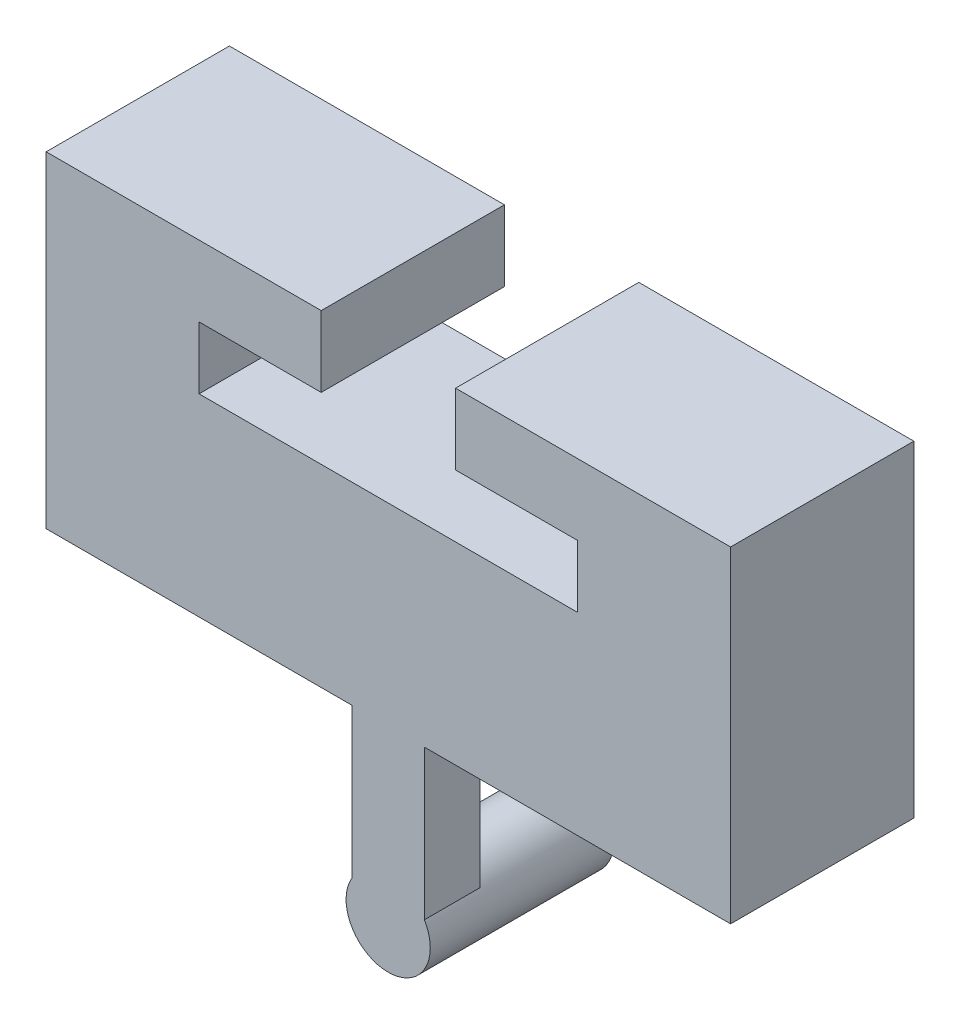
ISO-10303-21;
HEADER;
FILE_DESCRIPTION(('STEP AP214'),'2;1');
FILE_NAME('part.step','',(''),(''),'','','');
FILE_SCHEMA(('AUTOMOTIVE_DESIGN { 1 0 10303 214 1 1 1 1 }'));
ENDSEC;
DATA;
#1=APPLICATION_CONTEXT('core data for automotive mechanical design processes');
#2=APPLICATION_PROTOCOL_DEFINITION('international standard','automotive_design',2000,#1);
#3=PRODUCT_CONTEXT('',#1,'mechanical');
#4=PRODUCT('Part','Part','',(#3));
#5=PRODUCT_RELATED_PRODUCT_CATEGORY('part','',(#4));
#6=PRODUCT_DEFINITION_FORMATION('','',#4);
#7=PRODUCT_DEFINITION_CONTEXT('part definition',#1,'design');
#8=PRODUCT_DEFINITION('design','',#6,#7);
#9=PRODUCT_DEFINITION_SHAPE('','',#8);
#10=(LENGTH_UNIT() NAMED_UNIT(*) SI_UNIT(.MILLI.,.METRE.));
#11=(NAMED_UNIT(*) PLANE_ANGLE_UNIT() SI_UNIT($,.RADIAN.));
#12=(NAMED_UNIT(*) SI_UNIT($,.STERADIAN.) SOLID_ANGLE_UNIT());
#13=UNCERTAINTY_MEASURE_WITH_UNIT(LENGTH_MEASURE(1.E-05),#10,'distance_accuracy_value','');
#14=(GEOMETRIC_REPRESENTATION_CONTEXT(3) GLOBAL_UNCERTAINTY_ASSIGNED_CONTEXT((#13)) GLOBAL_UNIT_ASSIGNED_CONTEXT((#10,
#11,#12)) REPRESENTATION_CONTEXT('',''));
#15=CARTESIAN_POINT('',(0.,0.,0.));
#16=DIRECTION('',(0.,0.,1.));
#17=DIRECTION('',(1.,0.,0.));
#18=AXIS2_PLACEMENT_3D('',#15,#16,#17);
#19=CARTESIAN_POINT('',(0.,0.,38.1));
#20=DIRECTION('',(0.,1.,0.));
#21=DIRECTION('',(0.,0.,1.));
#22=AXIS2_PLACEMENT_3D('',#19,#20,#21);
#23=PLANE('',#22);
#24=DIRECTION('',(0.,0.,1.));
#25=VECTOR('',#24,1.);
#26=CARTESIAN_POINT('',(78.6479942270176,0.,26.5277188026789));
#27=LINE('',#26,#25);
#28=CARTESIAN_POINT('',(78.6479942270176,0.,26.5277188026789));
#29=VERTEX_POINT('',#28);
#30=CARTESIAN_POINT('',(78.6479942270176,0.,38.1));
#31=VERTEX_POINT('',#30);
#32=EDGE_CURVE('E268',#29,#31,#27,.T.);
#33=ORIENTED_EDGE('',*,*,#32,.F.);
#34=DIRECTION('',(-1.,0.,0.));
#35=VECTOR('',#34,1.);
#36=CARTESIAN_POINT('',(78.6479942270176,0.,26.5277188026789));
#37=LINE('',#36,#35);
#38=CARTESIAN_POINT('',(63.592005809709,0.,26.5277188026789));
#39=VERTEX_POINT('',#38);
#40=EDGE_CURVE('E283',#29,#39,#37,.T.);
#41=ORIENTED_EDGE('',*,*,#40,.T.);
#42=DIRECTION('',(0.,0.,1.));
#43=VECTOR('',#42,1.);
#44=CARTESIAN_POINT('',(63.592005809709,0.,26.5277188026789));
#45=LINE('',#44,#43);
#46=CARTESIAN_POINT('',(63.592005809709,0.,38.1));
#47=VERTEX_POINT('',#46);
#48=EDGE_CURVE('E177',#39,#47,#45,.T.);
#49=ORIENTED_EDGE('',*,*,#48,.T.);
#50=DIRECTION('',(1.,0.,0.));
#51=VECTOR('',#50,1.);
#52=CARTESIAN_POINT('',(0.,0.,38.1));
#53=LINE('',#52,#51);
#54=CARTESIAN_POINT('',(0.,0.,38.1));
#55=VERTEX_POINT('',#54);
#56=EDGE_CURVE('E116',#55,#47,#53,.T.);
#57=ORIENTED_EDGE('',*,*,#56,.F.);
#58=DIRECTION('',(0.,0.,-1.));
#59=VECTOR('',#58,1.);
#60=CARTESIAN_POINT('',(0.,0.,38.1));
#61=LINE('',#60,#59);
#62=CARTESIAN_POINT('',(0.,0.,0.));
#63=VERTEX_POINT('',#62);
#64=EDGE_CURVE('E47',#55,#63,#61,.T.);
#65=ORIENTED_EDGE('',*,*,#64,.T.);
#66=DIRECTION('',(1.,0.,0.));
#67=VECTOR('',#66,1.);
#68=CARTESIAN_POINT('',(0.,0.,0.));
#69=LINE('',#68,#67);
#70=CARTESIAN_POINT('',(142.319474342929,0.,0.));
#71=VERTEX_POINT('',#70);
#72=EDGE_CURVE('E176',#63,#71,#69,.T.);
#73=ORIENTED_EDGE('',*,*,#72,.T.);
#74=DIRECTION('',(0.,0.,-1.));
#75=VECTOR('',#74,1.);
#76=CARTESIAN_POINT('',(142.319474342929,0.,38.1));
#77=LINE('',#76,#75);
#78=CARTESIAN_POINT('',(142.319474342929,0.,38.1));
#79=VERTEX_POINT('',#78);
#80=EDGE_CURVE('E219',#79,#71,#77,.T.);
#81=ORIENTED_EDGE('',*,*,#80,.F.);
#82=EDGE_CURVE('E265',#31,#79,#53,.T.);
#83=ORIENTED_EDGE('',*,*,#82,.F.);
#84=EDGE_LOOP('',(#33,#41,#49,#57,#65,#73,#81,#83));
#85=FACE_BOUND('',#84,.T.);
#86=ADVANCED_FACE('F39',(#85),#23,.F.);
#87=CARTESIAN_POINT('',(0.,67.883016850886,38.1));
#88=DIRECTION('',(1.,0.,0.));
#89=DIRECTION('',(0.,0.,-1.));
#90=AXIS2_PLACEMENT_3D('',#87,#88,#89);
#91=PLANE('',#90);
#92=DIRECTION('',(0.,-1.,0.));
#93=VECTOR('',#92,1.);
#94=CARTESIAN_POINT('',(0.,67.883016850886,0.));
#95=LINE('',#94,#93);
#96=CARTESIAN_POINT('',(0.,67.883016850886,0.));
#97=VERTEX_POINT('',#96);
#98=EDGE_CURVE('E173',#97,#63,#95,.T.);
#99=ORIENTED_EDGE('',*,*,#98,.T.);
#100=ORIENTED_EDGE('',*,*,#64,.F.);
#101=DIRECTION('',(0.,-1.,0.));
#102=VECTOR('',#101,1.);
#103=CARTESIAN_POINT('',(0.,67.883016850886,38.1));
#104=LINE('',#103,#102);
#105=CARTESIAN_POINT('',(0.,67.883016850886,38.1));
#106=VERTEX_POINT('',#105);
#107=EDGE_CURVE('E197',#106,#55,#104,.T.);
#108=ORIENTED_EDGE('',*,*,#107,.F.);
#109=DIRECTION('',(0.,0.,-1.));
#110=VECTOR('',#109,1.);
#111=CARTESIAN_POINT('',(0.,67.883016850886,38.1));
#112=LINE('',#111,#110);
#113=EDGE_CURVE('E169',#106,#97,#112,.T.);
#114=ORIENTED_EDGE('',*,*,#113,.T.);
#115=EDGE_LOOP('',(#99,#100,#108,#114));
#116=FACE_BOUND('',#115,.T.);
#117=ADVANCED_FACE('F41',(#116),#91,.F.);
#118=CARTESIAN_POINT('',(142.319474342929,0.,38.1));
#119=DIRECTION('',(-1.,0.,0.));
#120=DIRECTION('',(0.,0.,1.));
#121=AXIS2_PLACEMENT_3D('',#118,#119,#120);
#122=PLANE('',#121);
#123=DIRECTION('',(0.,1.,0.));
#124=VECTOR('',#123,1.);
#125=CARTESIAN_POINT('',(142.319474342929,0.,0.));
#126=LINE('',#125,#124);
#127=CARTESIAN_POINT('',(142.319474342929,67.883016850886,0.));
#128=VERTEX_POINT('',#127);
#129=EDGE_CURVE('E179',#71,#128,#126,.T.);
#130=ORIENTED_EDGE('',*,*,#129,.T.);
#131=DIRECTION('',(0.,0.,-1.));
#132=VECTOR('',#131,1.);
#133=CARTESIAN_POINT('',(142.319474342929,67.883016850886,38.1));
#134=LINE('',#133,#132);
#135=CARTESIAN_POINT('',(142.319474342929,67.883016850886,38.1));
#136=VERTEX_POINT('',#135);
#137=EDGE_CURVE('E216',#136,#128,#134,.T.);
#138=ORIENTED_EDGE('',*,*,#137,.F.);
#139=DIRECTION('',(0.,1.,0.));
#140=VECTOR('',#139,1.);
#141=CARTESIAN_POINT('',(142.319474342929,0.,38.1));
#142=LINE('',#141,#140);
#143=EDGE_CURVE('E243',#79,#136,#142,.T.);
#144=ORIENTED_EDGE('',*,*,#143,.F.);
#145=ORIENTED_EDGE('',*,*,#80,.T.);
#146=EDGE_LOOP('',(#130,#138,#144,#145));
#147=FACE_BOUND('',#146,.T.);
#148=ADVANCED_FACE('F234',(#147),#122,.F.);
#149=CARTESIAN_POINT('',(142.319474342929,67.883016850886,38.1));
#150=DIRECTION('',(0.,-1.,0.));
#151=DIRECTION('',(0.,0.,-1.));
#152=AXIS2_PLACEMENT_3D('',#149,#150,#151);
#153=PLANE('',#152);
#154=DIRECTION('',(-1.,0.,0.));
#155=VECTOR('',#154,1.);
#156=CARTESIAN_POINT('',(142.319474342929,67.883016850886,0.));
#157=LINE('',#156,#155);
#158=CARTESIAN_POINT('',(85.1297371714643,67.883016850886,0.));
#159=VERTEX_POINT('',#158);
#160=EDGE_CURVE('E181',#128,#159,#157,.T.);
#161=ORIENTED_EDGE('',*,*,#160,.T.);
#162=DIRECTION('',(0.,0.,-1.));
#163=VECTOR('',#162,1.);
#164=CARTESIAN_POINT('',(85.1297371714643,67.883016850886,38.1));
#165=LINE('',#164,#163);
#166=CARTESIAN_POINT('',(85.1297371714643,67.883016850886,38.1));
#167=VERTEX_POINT('',#166);
#168=EDGE_CURVE('E213',#167,#159,#165,.T.);
#169=ORIENTED_EDGE('',*,*,#168,.F.);
#170=DIRECTION('',(-1.,0.,0.));
#171=VECTOR('',#170,1.);
#172=CARTESIAN_POINT('',(142.319474342929,67.883016850886,38.1));
#173=LINE('',#172,#171);
#174=EDGE_CURVE('E240',#136,#167,#173,.T.);
#175=ORIENTED_EDGE('',*,*,#174,.F.);
#176=ORIENTED_EDGE('',*,*,#137,.T.);
#177=EDGE_LOOP('',(#161,#169,#175,#176));
#178=FACE_BOUND('',#177,.T.);
#179=ADVANCED_FACE('F238',(#178),#153,.F.);
#180=CARTESIAN_POINT('',(85.1297371714643,67.883016850886,38.1));
#181=DIRECTION('',(1.,0.,0.));
#182=DIRECTION('',(0.,0.,-1.));
#183=AXIS2_PLACEMENT_3D('',#180,#181,#182);
#184=PLANE('',#183);
#185=DIRECTION('',(0.,-1.,0.));
#186=VECTOR('',#185,1.);
#187=CARTESIAN_POINT('',(85.1297371714643,67.883016850886,0.));
#188=LINE('',#187,#186);
#189=CARTESIAN_POINT('',(85.1297371714643,53.1441387077525,0.));
#190=VERTEX_POINT('',#189);
#191=EDGE_CURVE('E183',#159,#190,#188,.T.);
#192=ORIENTED_EDGE('',*,*,#191,.T.);
#193=DIRECTION('',(0.,0.,-1.));
#194=VECTOR('',#193,1.);
#195=CARTESIAN_POINT('',(85.1297371714643,53.1441387077525,38.1));
#196=LINE('',#195,#194);
#197=CARTESIAN_POINT('',(85.1297371714643,53.1441387077525,38.1));
#198=VERTEX_POINT('',#197);
#199=EDGE_CURVE('E210',#198,#190,#196,.T.);
#200=ORIENTED_EDGE('',*,*,#199,.F.);
#201=DIRECTION('',(0.,-1.,0.));
#202=VECTOR('',#201,1.);
#203=CARTESIAN_POINT('',(85.1297371714643,67.883016850886,38.1));
#204=LINE('',#203,#202);
#205=EDGE_CURVE('E242',#167,#198,#204,.T.);
#206=ORIENTED_EDGE('',*,*,#205,.F.);
#207=ORIENTED_EDGE('',*,*,#168,.T.);
#208=EDGE_LOOP('',(#192,#200,#206,#207));
#209=FACE_BOUND('',#208,.T.);
#210=ADVANCED_FACE('F333',(#209),#184,.F.);
#211=CARTESIAN_POINT('',(85.1297371714643,53.1441387077525,38.1));
#212=DIRECTION('',(0.,1.,0.));
#213=DIRECTION('',(0.,0.,1.));
#214=AXIS2_PLACEMENT_3D('',#211,#212,#213);
#215=PLANE('',#214);
#216=DIRECTION('',(1.,0.,0.));
#217=VECTOR('',#216,1.);
#218=CARTESIAN_POINT('',(85.1297371714643,53.1441387077525,0.));
#219=LINE('',#218,#217);
#220=CARTESIAN_POINT('',(110.529737171464,53.1441387077525,0.));
#221=VERTEX_POINT('',#220);
#222=EDGE_CURVE('E185',#190,#221,#219,.T.);
#223=ORIENTED_EDGE('',*,*,#222,.T.);
#224=DIRECTION('',(0.,0.,-1.));
#225=VECTOR('',#224,1.);
#226=CARTESIAN_POINT('',(110.529737171464,53.1441387077525,38.1));
#227=LINE('',#226,#225);
#228=CARTESIAN_POINT('',(110.529737171464,53.1441387077525,38.1));
#229=VERTEX_POINT('',#228);
#230=EDGE_CURVE('E207',#229,#221,#227,.T.);
#231=ORIENTED_EDGE('',*,*,#230,.F.);
#232=DIRECTION('',(1.,0.,0.));
#233=VECTOR('',#232,1.);
#234=CARTESIAN_POINT('',(85.1297371714643,53.1441387077525,38.1));
#235=LINE('',#234,#233);
#236=EDGE_CURVE('E245',#198,#229,#235,.T.);
#237=ORIENTED_EDGE('',*,*,#236,.F.);
#238=ORIENTED_EDGE('',*,*,#199,.T.);
#239=EDGE_LOOP('',(#223,#231,#237,#238));
#240=FACE_BOUND('',#239,.T.);
#241=ADVANCED_FACE('F336',(#240),#215,.F.);
#242=CARTESIAN_POINT('',(110.529737171464,53.1441387077525,38.1));
#243=DIRECTION('',(1.,0.,0.));
#244=DIRECTION('',(0.,0.,-1.));
#245=AXIS2_PLACEMENT_3D('',#242,#243,#244);
#246=PLANE('',#245);
#247=DIRECTION('',(0.,-1.,0.));
#248=VECTOR('',#247,1.);
#249=CARTESIAN_POINT('',(110.529737171464,53.1441387077525,0.));
#250=LINE('',#249,#248);
#251=CARTESIAN_POINT('',(110.529737171464,40.1901387077525,0.));
#252=VERTEX_POINT('',#251);
#253=EDGE_CURVE('E187',#221,#252,#250,.T.);
#254=ORIENTED_EDGE('',*,*,#253,.T.);
#255=DIRECTION('',(0.,0.,-1.));
#256=VECTOR('',#255,1.);
#257=CARTESIAN_POINT('',(110.529737171464,40.1901387077525,38.1));
#258=LINE('',#257,#256);
#259=CARTESIAN_POINT('',(110.529737171464,40.1901387077525,38.1));
#260=VERTEX_POINT('',#259);
#261=EDGE_CURVE('E204',#260,#252,#258,.T.);
#262=ORIENTED_EDGE('',*,*,#261,.F.);
#263=DIRECTION('',(0.,-1.,0.));
#264=VECTOR('',#263,1.);
#265=CARTESIAN_POINT('',(110.529737171464,53.1441387077525,38.1));
#266=LINE('',#265,#264);
#267=EDGE_CURVE('E251',#229,#260,#266,.T.);
#268=ORIENTED_EDGE('',*,*,#267,.F.);
#269=ORIENTED_EDGE('',*,*,#230,.T.);
#270=EDGE_LOOP('',(#254,#262,#268,#269));
#271=FACE_BOUND('',#270,.T.);
#272=ADVANCED_FACE('F340',(#271),#246,.F.);
#273=CARTESIAN_POINT('',(110.529737171464,40.1901387077525,38.1));
#274=DIRECTION('',(0.,-1.,0.));
#275=DIRECTION('',(1.,0.,0.));
#276=AXIS2_PLACEMENT_3D('',#273,#274,#275);
#277=PLANE('',#276);
#278=DIRECTION('',(-1.,0.,0.));
#279=VECTOR('',#278,1.);
#280=CARTESIAN_POINT('',(110.529737171464,40.1901387077525,0.));
#281=LINE('',#280,#279);
#282=CARTESIAN_POINT('',(31.7897371714643,40.1901387077525,0.));
#283=VERTEX_POINT('',#282);
#284=EDGE_CURVE('E189',#252,#283,#281,.T.);
#285=ORIENTED_EDGE('',*,*,#284,.T.);
#286=DIRECTION('',(0.,0.,-1.));
#287=VECTOR('',#286,1.);
#288=CARTESIAN_POINT('',(31.7897371714643,40.1901387077525,38.1));
#289=LINE('',#288,#287);
#290=CARTESIAN_POINT('',(31.7897371714643,40.1901387077525,38.1));
#291=VERTEX_POINT('',#290);
#292=EDGE_CURVE('E201',#291,#283,#289,.T.);
#293=ORIENTED_EDGE('',*,*,#292,.F.);
#294=DIRECTION('',(-1.,0.,0.));
#295=VECTOR('',#294,1.);
#296=CARTESIAN_POINT('',(110.529737171464,40.1901387077525,38.1));
#297=LINE('',#296,#295);
#298=EDGE_CURVE('E253',#260,#291,#297,.T.);
#299=ORIENTED_EDGE('',*,*,#298,.F.);
#300=ORIENTED_EDGE('',*,*,#261,.T.);
#301=EDGE_LOOP('',(#285,#293,#299,#300));
#302=FACE_BOUND('',#301,.T.);
#303=ADVANCED_FACE('F259',(#302),#277,.F.);
#304=CARTESIAN_POINT('',(31.7897371714643,40.1901387077525,38.1));
#305=DIRECTION('',(-1.,0.,0.));
#306=DIRECTION('',(0.,0.,1.));
#307=AXIS2_PLACEMENT_3D('',#304,#305,#306);
#308=PLANE('',#307);
#309=DIRECTION('',(0.,1.,0.));
#310=VECTOR('',#309,1.);
#311=CARTESIAN_POINT('',(31.7897371714643,40.1901387077525,0.));
#312=LINE('',#311,#310);
#313=CARTESIAN_POINT('',(31.7897371714643,53.1441387077525,0.));
#314=VERTEX_POINT('',#313);
#315=EDGE_CURVE('E191',#283,#314,#312,.T.);
#316=ORIENTED_EDGE('',*,*,#315,.T.);
#317=DIRECTION('',(0.,0.,-1.));
#318=VECTOR('',#317,1.);
#319=CARTESIAN_POINT('',(31.7897371714643,53.1441387077525,38.1));
#320=LINE('',#319,#318);
#321=CARTESIAN_POINT('',(31.7897371714643,53.1441387077525,38.1));
#322=VERTEX_POINT('',#321);
#323=EDGE_CURVE('E164',#322,#314,#320,.T.);
#324=ORIENTED_EDGE('',*,*,#323,.F.);
#325=DIRECTION('',(0.,1.,0.));
#326=VECTOR('',#325,1.);
#327=CARTESIAN_POINT('',(31.7897371714643,40.1901387077525,38.1));
#328=LINE('',#327,#326);
#329=EDGE_CURVE('E152',#291,#322,#328,.T.);
#330=ORIENTED_EDGE('',*,*,#329,.F.);
#331=ORIENTED_EDGE('',*,*,#292,.T.);
#332=EDGE_LOOP('',(#316,#324,#330,#331));
#333=FACE_BOUND('',#332,.T.);
#334=ADVANCED_FACE('F263',(#333),#308,.F.);
#335=CARTESIAN_POINT('',(31.7897371714643,53.1441387077525,38.1));
#336=DIRECTION('',(0.,1.,0.));
#337=DIRECTION('',(0.,0.,1.));
#338=AXIS2_PLACEMENT_3D('',#335,#336,#337);
#339=PLANE('',#338);
#340=DIRECTION('',(1.,0.,0.));
#341=VECTOR('',#340,1.);
#342=CARTESIAN_POINT('',(31.7897371714643,53.1441387077525,0.));
#343=LINE('',#342,#341);
#344=CARTESIAN_POINT('',(57.1897371714643,53.1441387077525,0.));
#345=VERTEX_POINT('',#344);
#346=EDGE_CURVE('E161',#314,#345,#343,.T.);
#347=ORIENTED_EDGE('',*,*,#346,.T.);
#348=DIRECTION('',(0.,0.,-1.));
#349=VECTOR('',#348,1.);
#350=CARTESIAN_POINT('',(57.1897371714643,53.1441387077525,38.1));
#351=LINE('',#350,#349);
#352=CARTESIAN_POINT('',(57.1897371714643,53.1441387077525,38.1));
#353=VERTEX_POINT('',#352);
#354=EDGE_CURVE('E158',#353,#345,#351,.T.);
#355=ORIENTED_EDGE('',*,*,#354,.F.);
#356=DIRECTION('',(1.,0.,0.));
#357=VECTOR('',#356,1.);
#358=CARTESIAN_POINT('',(31.7897371714643,53.1441387077525,38.1));
#359=LINE('',#358,#357);
#360=EDGE_CURVE('E145',#322,#353,#359,.T.);
#361=ORIENTED_EDGE('',*,*,#360,.F.);
#362=ORIENTED_EDGE('',*,*,#323,.T.);
#363=EDGE_LOOP('',(#347,#355,#361,#362));
#364=FACE_BOUND('',#363,.T.);
#365=ADVANCED_FACE('F159',(#364),#339,.F.);
#366=CARTESIAN_POINT('',(57.1897371714643,53.1441387077525,38.1));
#367=DIRECTION('',(-1.,0.,0.));
#368=DIRECTION('',(0.,-1.,0.));
#369=AXIS2_PLACEMENT_3D('',#366,#367,#368);
#370=PLANE('',#369);
#371=DIRECTION('',(0.,1.,0.));
#372=VECTOR('',#371,1.);
#373=CARTESIAN_POINT('',(57.1897371714643,53.1441387077525,0.));
#374=LINE('',#373,#372);
#375=CARTESIAN_POINT('',(57.1897371714643,67.883016850886,0.));
#376=VERTEX_POINT('',#375);
#377=EDGE_CURVE('E194',#345,#376,#374,.T.);
#378=ORIENTED_EDGE('',*,*,#377,.T.);
#379=DIRECTION('',(0.,0.,-1.));
#380=VECTOR('',#379,1.);
#381=CARTESIAN_POINT('',(57.1897371714643,67.883016850886,38.1));
#382=LINE('',#381,#380);
#383=CARTESIAN_POINT('',(57.1897371714643,67.883016850886,38.1));
#384=VERTEX_POINT('',#383);
#385=EDGE_CURVE('E165',#384,#376,#382,.T.);
#386=ORIENTED_EDGE('',*,*,#385,.F.);
#387=DIRECTION('',(0.,1.,0.));
#388=VECTOR('',#387,1.);
#389=CARTESIAN_POINT('',(57.1897371714643,53.1441387077525,38.1));
#390=LINE('',#389,#388);
#391=EDGE_CURVE('E149',#353,#384,#390,.T.);
#392=ORIENTED_EDGE('',*,*,#391,.F.);
#393=ORIENTED_EDGE('',*,*,#354,.T.);
#394=EDGE_LOOP('',(#378,#386,#392,#393));
#395=FACE_BOUND('',#394,.T.);
#396=ADVANCED_FACE('F167',(#395),#370,.F.);
#397=CARTESIAN_POINT('',(57.1897371714643,67.883016850886,38.1));
#398=DIRECTION('',(0.,-1.,0.));
#399=DIRECTION('',(1.,0.,0.));
#400=AXIS2_PLACEMENT_3D('',#397,#398,#399);
#401=PLANE('',#400);
#402=DIRECTION('',(-1.,0.,0.));
#403=VECTOR('',#402,1.);
#404=CARTESIAN_POINT('',(57.1897371714643,67.883016850886,0.));
#405=LINE('',#404,#403);
#406=EDGE_CURVE('E108',#376,#97,#405,.T.);
#407=ORIENTED_EDGE('',*,*,#406,.T.);
#408=ORIENTED_EDGE('',*,*,#113,.F.);
#409=DIRECTION('',(-1.,0.,0.));
#410=VECTOR('',#409,1.);
#411=CARTESIAN_POINT('',(57.1897371714643,67.883016850886,38.1));
#412=LINE('',#411,#410);
#413=EDGE_CURVE('E63',#384,#106,#412,.T.);
#414=ORIENTED_EDGE('',*,*,#413,.F.);
#415=ORIENTED_EDGE('',*,*,#385,.T.);
#416=EDGE_LOOP('',(#407,#408,#414,#415));
#417=FACE_BOUND('',#416,.T.);
#418=ADVANCED_FACE('F264',(#417),#401,.F.);
#419=CARTESIAN_POINT('',(0.,0.,38.1));
#420=DIRECTION('',(0.,0.,1.));
#421=DIRECTION('',(1.,0.,0.));
#422=AXIS2_PLACEMENT_3D('',#419,#420,#421);
#423=PLANE('',#422);
#424=DIRECTION('',(0.,-1.,0.));
#425=VECTOR('',#424,1.);
#426=CARTESIAN_POINT('',(63.592005809709,-40.0205890994918,38.1));
#427=LINE('',#426,#425);
#428=CARTESIAN_POINT('',(63.592005809709,-31.0993664955218,38.1));
#429=VERTEX_POINT('',#428);
#430=EDGE_CURVE('E54',#47,#429,#427,.T.);
#431=ORIENTED_EDGE('',*,*,#430,.T.);
#432=CARTESIAN_POINT('',(71.1200000248106,-35.5599777975068,38.1));
#433=DIRECTION('',(0.,0.,1.));
#434=DIRECTION('',(1.,0.,0.));
#435=AXIS2_PLACEMENT_3D('',#432,#433,#434);
#436=CIRCLE('',#435,8.75030000000001);
#437=CARTESIAN_POINT('',(78.6479942270176,-31.09936647376,38.1));
#438=VERTEX_POINT('',#437);
#439=EDGE_CURVE('E275',#429,#438,#436,.T.);
#440=ORIENTED_EDGE('',*,*,#439,.T.);
#441=DIRECTION('',(0.,1.,0.));
#442=VECTOR('',#441,1.);
#443=CARTESIAN_POINT('',(78.6479942270176,-40.0205891212536,38.1));
#444=LINE('',#443,#442);
#445=EDGE_CURVE('E280',#438,#31,#444,.T.);
#446=ORIENTED_EDGE('',*,*,#445,.T.);
#447=ORIENTED_EDGE('',*,*,#82,.T.);
#448=ORIENTED_EDGE('',*,*,#143,.T.);
#449=ORIENTED_EDGE('',*,*,#174,.T.);
#450=ORIENTED_EDGE('',*,*,#205,.T.);
#451=ORIENTED_EDGE('',*,*,#236,.T.);
#452=ORIENTED_EDGE('',*,*,#267,.T.);
#453=ORIENTED_EDGE('',*,*,#298,.T.);
#454=ORIENTED_EDGE('',*,*,#329,.T.);
#455=ORIENTED_EDGE('',*,*,#360,.T.);
#456=ORIENTED_EDGE('',*,*,#391,.T.);
#457=ORIENTED_EDGE('',*,*,#413,.T.);
#458=ORIENTED_EDGE('',*,*,#107,.T.);
#459=ORIENTED_EDGE('',*,*,#56,.T.);
#460=EDGE_LOOP('',(#431,#440,#446,#447,#448,#449,#450,#451,#452,#453,#454,#455,#456,#457,#458,#459));
#461=FACE_BOUND('',#460,.T.);
#462=ADVANCED_FACE('F147',(#461),#423,.T.);
#463=CARTESIAN_POINT('',(0.,0.,0.));
#464=DIRECTION('',(0.,0.,1.));
#465=DIRECTION('',(1.,0.,0.));
#466=AXIS2_PLACEMENT_3D('',#463,#464,#465);
#467=PLANE('',#466);
#468=ORIENTED_EDGE('',*,*,#98,.F.);
#469=ORIENTED_EDGE('',*,*,#406,.F.);
#470=ORIENTED_EDGE('',*,*,#377,.F.);
#471=ORIENTED_EDGE('',*,*,#346,.F.);
#472=ORIENTED_EDGE('',*,*,#315,.F.);
#473=ORIENTED_EDGE('',*,*,#284,.F.);
#474=ORIENTED_EDGE('',*,*,#253,.F.);
#475=ORIENTED_EDGE('',*,*,#222,.F.);
#476=ORIENTED_EDGE('',*,*,#191,.F.);
#477=ORIENTED_EDGE('',*,*,#160,.F.);
#478=ORIENTED_EDGE('',*,*,#129,.F.);
#479=ORIENTED_EDGE('',*,*,#72,.F.);
#480=EDGE_LOOP('',(#468,#469,#470,#471,#472,#473,#474,#475,#476,#477,#478,#479));
#481=FACE_BOUND('',#480,.T.);
#482=ADVANCED_FACE('F228',(#481),#467,.F.);
#483=CARTESIAN_POINT('',(71.1200000248106,-35.5599777975068,26.5277188026789));
#484=DIRECTION('',(0.,0.,1.));
#485=DIRECTION('',(1.,0.,0.));
#486=AXIS2_PLACEMENT_3D('',#483,#484,#485);
#487=CYLINDRICAL_SURFACE('',#486,8.75030000000001);
#488=ORIENTED_EDGE('',*,*,#439,.F.);
#489=DIRECTION('',(0.,0.,1.));
#490=VECTOR('',#489,1.);
#491=CARTESIAN_POINT('',(63.592005809709,-31.0993664955218,0.));
#492=LINE('',#491,#490);
#493=CARTESIAN_POINT('',(63.592005809709,-31.0993664955218,26.5277188026789));
#494=VERTEX_POINT('',#493);
#495=EDGE_CURVE('E298',#429,#494,#492,.F.);
#496=ORIENTED_EDGE('',*,*,#495,.T.);
#497=CARTESIAN_POINT('',(71.1200000248106,-35.5599777975068,26.5277188026789));
#498=DIRECTION('',(0.,0.,1.));
#499=DIRECTION('',(1.,0.,0.));
#500=AXIS2_PLACEMENT_3D('',#497,#498,#499);
#501=CIRCLE('',#500,8.7503);
#502=CARTESIAN_POINT('',(78.6479942270176,-31.09936647376,26.5277188026789));
#503=VERTEX_POINT('',#502);
#504=EDGE_CURVE('E11',#503,#494,#501,.T.);
#505=ORIENTED_EDGE('',*,*,#504,.F.);
#506=DIRECTION('',(0.,0.,1.));
#507=VECTOR('',#506,1.);
#508=CARTESIAN_POINT('',(78.6479942270176,-31.09936647376,0.));
#509=LINE('',#508,#507);
#510=EDGE_CURVE('E300',#503,#438,#509,.T.);
#511=ORIENTED_EDGE('',*,*,#510,.T.);
#512=EDGE_LOOP('',(#488,#496,#505,#511));
#513=FACE_BOUND('',#512,.T.);
#514=CARTESIAN_POINT('',(71.1200000248106,-35.5599777975068,0.));
#515=DIRECTION('',(0.,0.,1.));
#516=DIRECTION('',(1.,0.,0.));
#517=AXIS2_PLACEMENT_3D('',#514,#515,#516);
#518=CIRCLE('',#517,8.7503);
#519=CARTESIAN_POINT('',(79.8703000248106,-35.5599777975068,0.));
#520=VERTEX_POINT('',#519);
#521=EDGE_CURVE('E304',#520,#520,#518,.T.);
#522=ORIENTED_EDGE('',*,*,#521,.T.);
#523=EDGE_LOOP('',(#522));
#524=FACE_BOUND('',#523,.T.);
#525=ADVANCED_FACE('F310',(#513,#524),#487,.T.);
#526=CARTESIAN_POINT('',(63.592005809709,-40.0205890994918,26.5277188026789));
#527=DIRECTION('',(-1.,0.,0.));
#528=DIRECTION('',(0.,0.,1.));
#529=AXIS2_PLACEMENT_3D('',#526,#527,#528);
#530=PLANE('',#529);
#531=ORIENTED_EDGE('',*,*,#495,.F.);
#532=ORIENTED_EDGE('',*,*,#430,.F.);
#533=ORIENTED_EDGE('',*,*,#48,.F.);
#534=DIRECTION('',(0.,-1.,0.));
#535=VECTOR('',#534,1.);
#536=CARTESIAN_POINT('',(63.592005809709,-40.0205890994918,26.5277188026789));
#537=LINE('',#536,#535);
#538=EDGE_CURVE('E289',#39,#494,#537,.T.);
#539=ORIENTED_EDGE('',*,*,#538,.T.);
#540=EDGE_LOOP('',(#531,#532,#533,#539));
#541=FACE_BOUND('',#540,.T.);
#542=ADVANCED_FACE('F359',(#541),#530,.T.);
#543=CARTESIAN_POINT('',(78.6479942270176,-40.0205891212536,26.5277188026789));
#544=DIRECTION('',(1.,0.,0.));
#545=DIRECTION('',(0.,0.,-1.));
#546=AXIS2_PLACEMENT_3D('',#543,#544,#545);
#547=PLANE('',#546);
#548=ORIENTED_EDGE('',*,*,#510,.F.);
#549=DIRECTION('',(0.,1.,0.));
#550=VECTOR('',#549,1.);
#551=CARTESIAN_POINT('',(78.6479942270176,-40.0205891212536,26.5277188026789));
#552=LINE('',#551,#550);
#553=EDGE_CURVE('E279',#503,#29,#552,.T.);
#554=ORIENTED_EDGE('',*,*,#553,.T.);
#555=ORIENTED_EDGE('',*,*,#32,.T.);
#556=ORIENTED_EDGE('',*,*,#445,.F.);
#557=EDGE_LOOP('',(#548,#554,#555,#556));
#558=FACE_BOUND('',#557,.T.);
#559=ADVANCED_FACE('F319',(#558),#547,.T.);
#560=CARTESIAN_POINT('',(71.1200000248106,-35.5599777975068,26.5277188026789));
#561=DIRECTION('',(0.,0.,1.));
#562=DIRECTION('',(1.,0.,0.));
#563=AXIS2_PLACEMENT_3D('',#560,#561,#562);
#564=PLANE('',#563);
#565=ORIENTED_EDGE('',*,*,#553,.F.);
#566=ORIENTED_EDGE('',*,*,#504,.T.);
#567=ORIENTED_EDGE('',*,*,#538,.F.);
#568=ORIENTED_EDGE('',*,*,#40,.F.);
#569=EDGE_LOOP('',(#565,#566,#567,#568));
#570=FACE_BOUND('',#569,.T.);
#571=ADVANCED_FACE('F314',(#570),#564,.F.);
#572=CARTESIAN_POINT('',(71.1200000248106,-35.5599777975068,0.));
#573=DIRECTION('',(0.,0.,1.));
#574=DIRECTION('',(1.,0.,0.));
#575=AXIS2_PLACEMENT_3D('',#572,#573,#574);
#576=PLANE('',#575);
#577=ORIENTED_EDGE('',*,*,#521,.F.);
#578=EDGE_LOOP('',(#577));
#579=FACE_BOUND('',#578,.T.);
#580=ADVANCED_FACE('F312',(#579),#576,.F.);
#581=CLOSED_SHELL('',(#86,#117,#148,#179,#210,#241,#272,#303,#334,#365,#396,#418,#462,#482,#525,
#542,#559,#571,#580));
#582=MANIFOLD_SOLID_BREP('B2',#581);
#583=ADVANCED_BREP_SHAPE_REPRESENTATION('',(#18,#582),#14);
#584=SHAPE_DEFINITION_REPRESENTATION(#9,#583);
ENDSEC;
END-ISO-10303-21;
